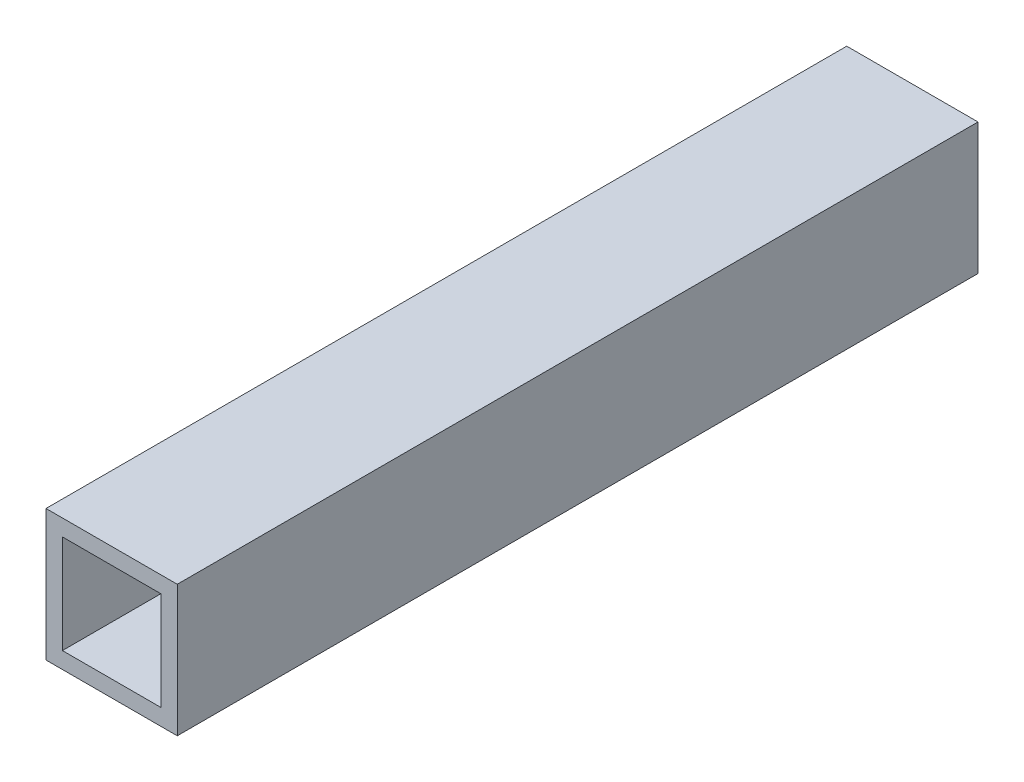
ISO-10303-21;
HEADER;
FILE_DESCRIPTION(('STEP AP214'),'2;1');
FILE_NAME('part.step','',(''),(''),'','','');
FILE_SCHEMA(('AUTOMOTIVE_DESIGN { 1 0 10303 214 1 1 1 1 }'));
ENDSEC;
DATA;
#1=APPLICATION_CONTEXT('core data for automotive mechanical design processes');
#2=APPLICATION_PROTOCOL_DEFINITION('international standard','automotive_design',2000,#1);
#3=PRODUCT_CONTEXT('',#1,'mechanical');
#4=PRODUCT('Part','Part','',(#3));
#5=PRODUCT_RELATED_PRODUCT_CATEGORY('part','',(#4));
#6=PRODUCT_DEFINITION_FORMATION('','',#4);
#7=PRODUCT_DEFINITION_CONTEXT('part definition',#1,'design');
#8=PRODUCT_DEFINITION('design','',#6,#7);
#9=PRODUCT_DEFINITION_SHAPE('','',#8);
#10=(LENGTH_UNIT() NAMED_UNIT(*) SI_UNIT(.MILLI.,.METRE.));
#11=(NAMED_UNIT(*) PLANE_ANGLE_UNIT() SI_UNIT($,.RADIAN.));
#12=(NAMED_UNIT(*) SI_UNIT($,.STERADIAN.) SOLID_ANGLE_UNIT());
#13=UNCERTAINTY_MEASURE_WITH_UNIT(LENGTH_MEASURE(1.E-05),#10,'distance_accuracy_value','');
#14=(GEOMETRIC_REPRESENTATION_CONTEXT(3) GLOBAL_UNCERTAINTY_ASSIGNED_CONTEXT((#13)) GLOBAL_UNIT_ASSIGNED_CONTEXT((#10,
#11,#12)) REPRESENTATION_CONTEXT('',''));
#15=CARTESIAN_POINT('',(0.,0.,0.));
#16=DIRECTION('',(0.,0.,1.));
#17=DIRECTION('',(1.,0.,0.));
#18=AXIS2_PLACEMENT_3D('',#15,#16,#17);
#19=CARTESIAN_POINT('',(0.,0.,154.94));
#20=DIRECTION('',(0.,0.,1.));
#21=DIRECTION('',(1.,0.,0.));
#22=AXIS2_PLACEMENT_3D('',#19,#20,#21);
#23=PLANE('',#22);
#24=DIRECTION('',(0.,1.,0.));
#25=VECTOR('',#24,1.);
#26=CARTESIAN_POINT('',(0.,0.,154.94));
#27=LINE('',#26,#25);
#28=CARTESIAN_POINT('',(0.,0.,154.94));
#29=VERTEX_POINT('',#28);
#30=CARTESIAN_POINT('',(0.,25.4,154.94));
#31=VERTEX_POINT('',#30);
#32=EDGE_CURVE('E153',#29,#31,#27,.T.);
#33=ORIENTED_EDGE('',*,*,#32,.T.);
#34=DIRECTION('',(-1.,0.,0.));
#35=VECTOR('',#34,1.);
#36=CARTESIAN_POINT('',(0.,25.4,154.94));
#37=LINE('',#36,#35);
#38=CARTESIAN_POINT('',(-25.4,25.4,154.94));
#39=VERTEX_POINT('',#38);
#40=EDGE_CURVE('E157',#31,#39,#37,.T.);
#41=ORIENTED_EDGE('',*,*,#40,.T.);
#42=DIRECTION('',(0.,-1.,0.));
#43=VECTOR('',#42,1.);
#44=CARTESIAN_POINT('',(-25.4,0.,154.94));
#45=LINE('',#44,#43);
#46=CARTESIAN_POINT('',(-25.4,0.,154.94));
#47=VERTEX_POINT('',#46);
#48=EDGE_CURVE('E161',#39,#47,#45,.T.);
#49=ORIENTED_EDGE('',*,*,#48,.T.);
#50=DIRECTION('',(1.,0.,0.));
#51=VECTOR('',#50,1.);
#52=CARTESIAN_POINT('',(0.,0.,154.94));
#53=LINE('',#52,#51);
#54=EDGE_CURVE('E164',#47,#29,#53,.T.);
#55=ORIENTED_EDGE('',*,*,#54,.T.);
#56=EDGE_LOOP('',(#33,#41,#49,#55));
#57=FACE_BOUND('',#56,.T.);
#58=DIRECTION('',(1.,0.,0.));
#59=VECTOR('',#58,1.);
#60=CARTESIAN_POINT('',(-22.225,3.175,154.94));
#61=LINE('',#60,#59);
#62=CARTESIAN_POINT('',(-22.225,3.175,154.94));
#63=VERTEX_POINT('',#62);
#64=CARTESIAN_POINT('',(-3.175,3.175,154.94));
#65=VERTEX_POINT('',#64);
#66=EDGE_CURVE('E114',#63,#65,#61,.T.);
#67=ORIENTED_EDGE('',*,*,#66,.F.);
#68=DIRECTION('',(0.,-1.,0.));
#69=VECTOR('',#68,1.);
#70=CARTESIAN_POINT('',(-22.225,22.225,154.94));
#71=LINE('',#70,#69);
#72=CARTESIAN_POINT('',(-22.225,22.225,154.94));
#73=VERTEX_POINT('',#72);
#74=EDGE_CURVE('E105',#73,#63,#71,.T.);
#75=ORIENTED_EDGE('',*,*,#74,.F.);
#76=DIRECTION('',(-1.,0.,0.));
#77=VECTOR('',#76,1.);
#78=CARTESIAN_POINT('',(-22.225,22.225,154.94));
#79=LINE('',#78,#77);
#80=CARTESIAN_POINT('',(-3.175,22.225,154.94));
#81=VERTEX_POINT('',#80);
#82=EDGE_CURVE('E131',#81,#73,#79,.T.);
#83=ORIENTED_EDGE('',*,*,#82,.F.);
#84=DIRECTION('',(0.,1.,0.));
#85=VECTOR('',#84,1.);
#86=CARTESIAN_POINT('',(-3.175,22.225,154.94));
#87=LINE('',#86,#85);
#88=EDGE_CURVE('E127',#65,#81,#87,.T.);
#89=ORIENTED_EDGE('',*,*,#88,.F.);
#90=EDGE_LOOP('',(#67,#75,#83,#89));
#91=FACE_BOUND('',#90,.T.);
#92=ADVANCED_FACE('F39',(#57,#91),#23,.T.);
#93=CARTESIAN_POINT('',(0.,0.,0.));
#94=DIRECTION('',(0.,0.,1.));
#95=DIRECTION('',(1.,0.,0.));
#96=AXIS2_PLACEMENT_3D('',#93,#94,#95);
#97=PLANE('',#96);
#98=DIRECTION('',(0.,1.,0.));
#99=VECTOR('',#98,1.);
#100=CARTESIAN_POINT('',(0.,0.,0.));
#101=LINE('',#100,#99);
#102=CARTESIAN_POINT('',(0.,0.,0.));
#103=VERTEX_POINT('',#102);
#104=CARTESIAN_POINT('',(0.,25.4,0.));
#105=VERTEX_POINT('',#104);
#106=EDGE_CURVE('E123',#103,#105,#101,.T.);
#107=ORIENTED_EDGE('',*,*,#106,.F.);
#108=DIRECTION('',(1.,0.,0.));
#109=VECTOR('',#108,1.);
#110=CARTESIAN_POINT('',(0.,0.,0.));
#111=LINE('',#110,#109);
#112=CARTESIAN_POINT('',(-25.4,0.,0.));
#113=VERTEX_POINT('',#112);
#114=EDGE_CURVE('E158',#113,#103,#111,.T.);
#115=ORIENTED_EDGE('',*,*,#114,.F.);
#116=DIRECTION('',(0.,-1.,0.));
#117=VECTOR('',#116,1.);
#118=CARTESIAN_POINT('',(-25.4,0.,0.));
#119=LINE('',#118,#117);
#120=CARTESIAN_POINT('',(-25.4,25.4,0.));
#121=VERTEX_POINT('',#120);
#122=EDGE_CURVE('E174',#121,#113,#119,.T.);
#123=ORIENTED_EDGE('',*,*,#122,.F.);
#124=DIRECTION('',(-1.,0.,0.));
#125=VECTOR('',#124,1.);
#126=CARTESIAN_POINT('',(0.,25.4,0.));
#127=LINE('',#126,#125);
#128=EDGE_CURVE('E171',#105,#121,#127,.T.);
#129=ORIENTED_EDGE('',*,*,#128,.F.);
#130=EDGE_LOOP('',(#107,#115,#123,#129));
#131=FACE_BOUND('',#130,.T.);
#132=DIRECTION('',(0.,-1.,0.));
#133=VECTOR('',#132,1.);
#134=CARTESIAN_POINT('',(-22.225,22.225,0.));
#135=LINE('',#134,#133);
#136=CARTESIAN_POINT('',(-22.225,22.225,0.));
#137=VERTEX_POINT('',#136);
#138=CARTESIAN_POINT('',(-22.225,3.175,0.));
#139=VERTEX_POINT('',#138);
#140=EDGE_CURVE('E63',#137,#139,#135,.T.);
#141=ORIENTED_EDGE('',*,*,#140,.T.);
#142=DIRECTION('',(1.,0.,0.));
#143=VECTOR('',#142,1.);
#144=CARTESIAN_POINT('',(-22.225,3.175,0.));
#145=LINE('',#144,#143);
#146=CARTESIAN_POINT('',(-3.175,3.175,0.));
#147=VERTEX_POINT('',#146);
#148=EDGE_CURVE('E121',#139,#147,#145,.T.);
#149=ORIENTED_EDGE('',*,*,#148,.T.);
#150=DIRECTION('',(0.,1.,0.));
#151=VECTOR('',#150,1.);
#152=CARTESIAN_POINT('',(-3.175,22.225,0.));
#153=LINE('',#152,#151);
#154=CARTESIAN_POINT('',(-3.175,22.225,0.));
#155=VERTEX_POINT('',#154);
#156=EDGE_CURVE('E140',#147,#155,#153,.T.);
#157=ORIENTED_EDGE('',*,*,#156,.T.);
#158=DIRECTION('',(-1.,0.,0.));
#159=VECTOR('',#158,1.);
#160=CARTESIAN_POINT('',(-22.225,22.225,0.));
#161=LINE('',#160,#159);
#162=EDGE_CURVE('E115',#155,#137,#161,.T.);
#163=ORIENTED_EDGE('',*,*,#162,.T.);
#164=EDGE_LOOP('',(#141,#149,#157,#163));
#165=FACE_BOUND('',#164,.T.);
#166=ADVANCED_FACE('F197',(#131,#165),#97,.F.);
#167=CARTESIAN_POINT('',(0.,0.,154.94));
#168=DIRECTION('',(-1.,0.,0.));
#169=DIRECTION('',(0.,-1.,0.));
#170=AXIS2_PLACEMENT_3D('',#167,#168,#169);
#171=PLANE('',#170);
#172=ORIENTED_EDGE('',*,*,#106,.T.);
#173=DIRECTION('',(0.,0.,-1.));
#174=VECTOR('',#173,1.);
#175=CARTESIAN_POINT('',(0.,25.4,154.94));
#176=LINE('',#175,#174);
#177=EDGE_CURVE('E11',#31,#105,#176,.T.);
#178=ORIENTED_EDGE('',*,*,#177,.F.);
#179=ORIENTED_EDGE('',*,*,#32,.F.);
#180=DIRECTION('',(0.,0.,-1.));
#181=VECTOR('',#180,1.);
#182=CARTESIAN_POINT('',(0.,0.,154.94));
#183=LINE('',#182,#181);
#184=EDGE_CURVE('E167',#29,#103,#183,.T.);
#185=ORIENTED_EDGE('',*,*,#184,.T.);
#186=EDGE_LOOP('',(#172,#178,#179,#185));
#187=FACE_BOUND('',#186,.T.);
#188=ADVANCED_FACE('F41',(#187),#171,.F.);
#189=CARTESIAN_POINT('',(0.,25.4,154.94));
#190=DIRECTION('',(0.,-1.,0.));
#191=DIRECTION('',(1.,0.,0.));
#192=AXIS2_PLACEMENT_3D('',#189,#190,#191);
#193=PLANE('',#192);
#194=ORIENTED_EDGE('',*,*,#128,.T.);
#195=DIRECTION('',(0.,0.,-1.));
#196=VECTOR('',#195,1.);
#197=CARTESIAN_POINT('',(-25.4,25.4,154.94));
#198=LINE('',#197,#196);
#199=EDGE_CURVE('E48',#39,#121,#198,.T.);
#200=ORIENTED_EDGE('',*,*,#199,.F.);
#201=ORIENTED_EDGE('',*,*,#40,.F.);
#202=ORIENTED_EDGE('',*,*,#177,.T.);
#203=EDGE_LOOP('',(#194,#200,#201,#202));
#204=FACE_BOUND('',#203,.T.);
#205=ADVANCED_FACE('F207',(#204),#193,.F.);
#206=CARTESIAN_POINT('',(-25.4,0.,154.94));
#207=DIRECTION('',(1.,0.,0.));
#208=DIRECTION('',(0.,0.,-1.));
#209=AXIS2_PLACEMENT_3D('',#206,#207,#208);
#210=PLANE('',#209);
#211=ORIENTED_EDGE('',*,*,#122,.T.);
#212=DIRECTION('',(0.,0.,-1.));
#213=VECTOR('',#212,1.);
#214=CARTESIAN_POINT('',(-25.4,0.,154.94));
#215=LINE('',#214,#213);
#216=EDGE_CURVE('E182',#47,#113,#215,.T.);
#217=ORIENTED_EDGE('',*,*,#216,.F.);
#218=ORIENTED_EDGE('',*,*,#48,.F.);
#219=ORIENTED_EDGE('',*,*,#199,.T.);
#220=EDGE_LOOP('',(#211,#217,#218,#219));
#221=FACE_BOUND('',#220,.T.);
#222=ADVANCED_FACE('F191',(#221),#210,.F.);
#223=CARTESIAN_POINT('',(0.,0.,154.94));
#224=DIRECTION('',(0.,1.,0.));
#225=DIRECTION('',(0.,0.,1.));
#226=AXIS2_PLACEMENT_3D('',#223,#224,#225);
#227=PLANE('',#226);
#228=ORIENTED_EDGE('',*,*,#114,.T.);
#229=ORIENTED_EDGE('',*,*,#184,.F.);
#230=ORIENTED_EDGE('',*,*,#54,.F.);
#231=ORIENTED_EDGE('',*,*,#216,.T.);
#232=EDGE_LOOP('',(#228,#229,#230,#231));
#233=FACE_BOUND('',#232,.T.);
#234=ADVANCED_FACE('F201',(#233),#227,.F.);
#235=CARTESIAN_POINT('',(-22.225,22.225,154.94));
#236=DIRECTION('',(1.,0.,0.));
#237=DIRECTION('',(0.,1.,0.));
#238=AXIS2_PLACEMENT_3D('',#235,#236,#237);
#239=PLANE('',#238);
#240=ORIENTED_EDGE('',*,*,#140,.F.);
#241=DIRECTION('',(0.,0.,-1.));
#242=VECTOR('',#241,1.);
#243=CARTESIAN_POINT('',(-22.225,22.225,154.94));
#244=LINE('',#243,#242);
#245=EDGE_CURVE('E109',#73,#137,#244,.T.);
#246=ORIENTED_EDGE('',*,*,#245,.F.);
#247=ORIENTED_EDGE('',*,*,#74,.T.);
#248=DIRECTION('',(0.,0.,-1.));
#249=VECTOR('',#248,1.);
#250=CARTESIAN_POINT('',(-22.225,3.175,154.94));
#251=LINE('',#250,#249);
#252=EDGE_CURVE('E108',#63,#139,#251,.T.);
#253=ORIENTED_EDGE('',*,*,#252,.T.);
#254=EDGE_LOOP('',(#240,#246,#247,#253));
#255=FACE_BOUND('',#254,.T.);
#256=ADVANCED_FACE('F107',(#255),#239,.T.);
#257=CARTESIAN_POINT('',(-22.225,3.175,154.94));
#258=DIRECTION('',(0.,1.,0.));
#259=DIRECTION('',(0.,0.,1.));
#260=AXIS2_PLACEMENT_3D('',#257,#258,#259);
#261=PLANE('',#260);
#262=ORIENTED_EDGE('',*,*,#148,.F.);
#263=ORIENTED_EDGE('',*,*,#252,.F.);
#264=ORIENTED_EDGE('',*,*,#66,.T.);
#265=DIRECTION('',(0.,0.,-1.));
#266=VECTOR('',#265,1.);
#267=CARTESIAN_POINT('',(-3.175,3.175,154.94));
#268=LINE('',#267,#266);
#269=EDGE_CURVE('E124',#65,#147,#268,.T.);
#270=ORIENTED_EDGE('',*,*,#269,.T.);
#271=EDGE_LOOP('',(#262,#263,#264,#270));
#272=FACE_BOUND('',#271,.T.);
#273=ADVANCED_FACE('F118',(#272),#261,.T.);
#274=CARTESIAN_POINT('',(-3.175,22.225,154.94));
#275=DIRECTION('',(-1.,0.,0.));
#276=DIRECTION('',(0.,-1.,0.));
#277=AXIS2_PLACEMENT_3D('',#274,#275,#276);
#278=PLANE('',#277);
#279=ORIENTED_EDGE('',*,*,#156,.F.);
#280=ORIENTED_EDGE('',*,*,#269,.F.);
#281=ORIENTED_EDGE('',*,*,#88,.T.);
#282=DIRECTION('',(0.,0.,-1.));
#283=VECTOR('',#282,1.);
#284=CARTESIAN_POINT('',(-3.175,22.225,154.94));
#285=LINE('',#284,#283);
#286=EDGE_CURVE('E55',#81,#155,#285,.T.);
#287=ORIENTED_EDGE('',*,*,#286,.T.);
#288=EDGE_LOOP('',(#279,#280,#281,#287));
#289=FACE_BOUND('',#288,.T.);
#290=ADVANCED_FACE('F230',(#289),#278,.T.);
#291=CARTESIAN_POINT('',(-22.225,22.225,154.94));
#292=DIRECTION('',(0.,-1.,0.));
#293=DIRECTION('',(0.,0.,-1.));
#294=AXIS2_PLACEMENT_3D('',#291,#292,#293);
#295=PLANE('',#294);
#296=ORIENTED_EDGE('',*,*,#162,.F.);
#297=ORIENTED_EDGE('',*,*,#286,.F.);
#298=ORIENTED_EDGE('',*,*,#82,.T.);
#299=ORIENTED_EDGE('',*,*,#245,.T.);
#300=EDGE_LOOP('',(#296,#297,#298,#299));
#301=FACE_BOUND('',#300,.T.);
#302=ADVANCED_FACE('F234',(#301),#295,.T.);
#303=CLOSED_SHELL('',(#92,#166,#188,#205,#222,#234,#256,#273,#290,#302));
#304=MANIFOLD_SOLID_BREP('B2',#303);
#305=ADVANCED_BREP_SHAPE_REPRESENTATION('',(#18,#304),#14);
#306=SHAPE_DEFINITION_REPRESENTATION(#9,#305);
ENDSEC;
END-ISO-10303-21;
